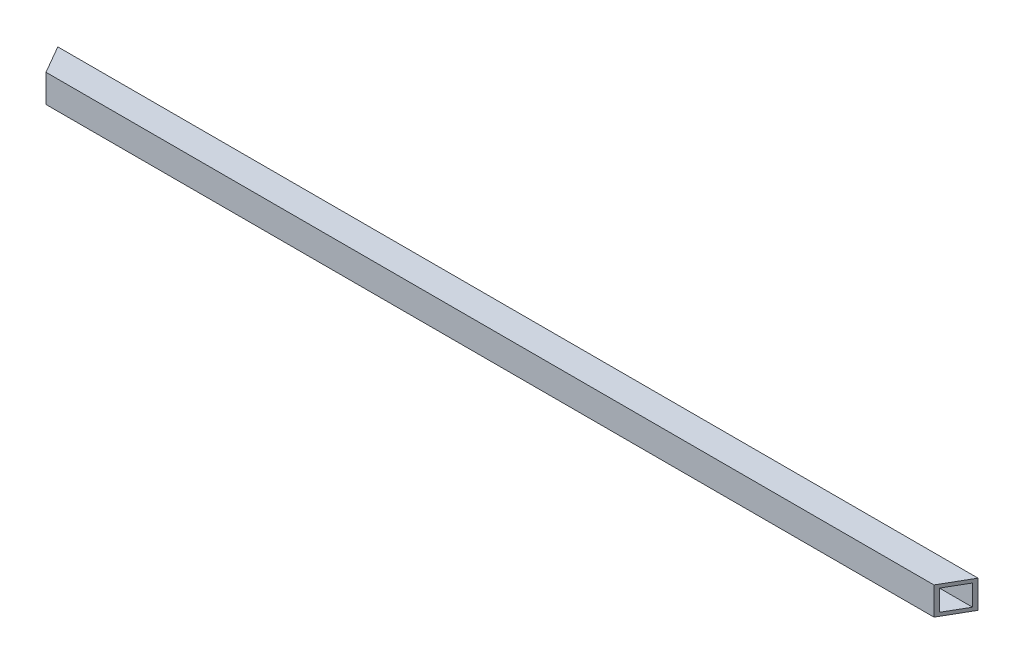
ISO-10303-21;
HEADER;
FILE_DESCRIPTION(('STEP AP214'),'2;1');
FILE_NAME('part.step','',(''),(''),'','','');
FILE_SCHEMA(('AUTOMOTIVE_DESIGN { 1 0 10303 214 1 1 1 1 }'));
ENDSEC;
DATA;
#1=APPLICATION_CONTEXT('core data for automotive mechanical design processes');
#2=APPLICATION_PROTOCOL_DEFINITION('international standard','automotive_design',2000,#1);
#3=PRODUCT_CONTEXT('',#1,'mechanical');
#4=PRODUCT('Part','Part','',(#3));
#5=PRODUCT_RELATED_PRODUCT_CATEGORY('part','',(#4));
#6=PRODUCT_DEFINITION_FORMATION('','',#4);
#7=PRODUCT_DEFINITION_CONTEXT('part definition',#1,'design');
#8=PRODUCT_DEFINITION('design','',#6,#7);
#9=PRODUCT_DEFINITION_SHAPE('','',#8);
#10=(LENGTH_UNIT() NAMED_UNIT(*) SI_UNIT(.MILLI.,.METRE.));
#11=(NAMED_UNIT(*) PLANE_ANGLE_UNIT() SI_UNIT($,.RADIAN.));
#12=(NAMED_UNIT(*) SI_UNIT($,.STERADIAN.) SOLID_ANGLE_UNIT());
#13=UNCERTAINTY_MEASURE_WITH_UNIT(LENGTH_MEASURE(1.E-05),#10,'distance_accuracy_value','');
#14=(GEOMETRIC_REPRESENTATION_CONTEXT(3) GLOBAL_UNCERTAINTY_ASSIGNED_CONTEXT((#13)) GLOBAL_UNIT_ASSIGNED_CONTEXT((#10,
#11,#12)) REPRESENTATION_CONTEXT('',''));
#15=CARTESIAN_POINT('',(0.,0.,0.));
#16=DIRECTION('',(0.,0.,1.));
#17=DIRECTION('',(1.,0.,0.));
#18=AXIS2_PLACEMENT_3D('',#15,#16,#17);
#19=CARTESIAN_POINT('',(-807.917743454652,0.,387.35));
#20=DIRECTION('',(0.,0.,1.));
#21=DIRECTION('',(1.,0.,0.));
#22=AXIS2_PLACEMENT_3D('',#19,#20,#21);
#23=PLANE('',#22);
#24=DIRECTION('',(1.,0.,0.));
#25=VECTOR('',#24,1.);
#26=CARTESIAN_POINT('',(0.,50.8,387.35));
#27=LINE('',#26,#25);
#28=CARTESIAN_POINT('',(-807.917743454659,50.8,387.350000000004));
#29=VERTEX_POINT('',#28);
#30=CARTESIAN_POINT('',(807.917743454652,50.8,387.35));
#31=VERTEX_POINT('',#30);
#32=EDGE_CURVE('E137',#29,#31,#27,.T.);
#33=ORIENTED_EDGE('',*,*,#32,.F.);
#34=DIRECTION('',(0.,1.,0.));
#35=VECTOR('',#34,1.);
#36=CARTESIAN_POINT('',(-807.917743454665,0.,387.350000000008));
#37=LINE('',#36,#35);
#38=CARTESIAN_POINT('',(-807.917743454655,0.,387.350000000002));
#39=VERTEX_POINT('',#38);
#40=EDGE_CURVE('E104',#39,#29,#37,.T.);
#41=ORIENTED_EDGE('',*,*,#40,.F.);
#42=DIRECTION('',(1.,0.,0.));
#43=VECTOR('',#42,1.);
#44=CARTESIAN_POINT('',(0.,0.,387.35));
#45=LINE('',#44,#43);
#46=CARTESIAN_POINT('',(807.917743454652,0.,387.35));
#47=VERTEX_POINT('',#46);
#48=EDGE_CURVE('E88',#39,#47,#45,.T.);
#49=ORIENTED_EDGE('',*,*,#48,.T.);
#50=DIRECTION('',(0.,1.,0.));
#51=VECTOR('',#50,1.);
#52=CARTESIAN_POINT('',(807.917743454652,0.,387.35));
#53=LINE('',#52,#51);
#54=EDGE_CURVE('E127',#31,#47,#53,.F.);
#55=ORIENTED_EDGE('',*,*,#54,.F.);
#56=EDGE_LOOP('',(#33,#41,#49,#55));
#57=FACE_BOUND('',#56,.T.);
#58=ADVANCED_FACE('F16',(#57),#23,.T.);
#59=CARTESIAN_POINT('',(0.,6.35,0.));
#60=DIRECTION('',(0.,1.,0.));
#61=DIRECTION('',(0.,0.,1.));
#62=AXIS2_PLACEMENT_3D('',#59,#60,#61);
#63=PLANE('',#62);
#64=DIRECTION('',(0.500000000000017,0.,-0.866025403784429));
#65=VECTOR('',#64,1.);
#66=CARTESIAN_POINT('',(807.917743454652,6.35,387.35));
#67=LINE('',#66,#65);
#68=CARTESIAN_POINT('',(833.580962920299,6.35,342.899999999978));
#69=VERTEX_POINT('',#68);
#70=CARTESIAN_POINT('',(811.58391766406,6.35,380.999999999993));
#71=VERTEX_POINT('',#70);
#72=EDGE_CURVE('E84',#69,#71,#67,.F.);
#73=ORIENTED_EDGE('',*,*,#72,.F.);
#74=DIRECTION('',(-1.,0.,0.));
#75=VECTOR('',#74,1.);
#76=CARTESIAN_POINT('',(837.247137129504,6.35,342.9));
#77=LINE('',#76,#75);
#78=CARTESIAN_POINT('',(-833.580962920303,6.35,342.89999999998));
#79=VERTEX_POINT('',#78);
#80=EDGE_CURVE('E77',#69,#79,#77,.T.);
#81=ORIENTED_EDGE('',*,*,#80,.T.);
#82=DIRECTION('',(0.500000000000017,0.,0.866025403784429));
#83=VECTOR('',#82,1.);
#84=CARTESIAN_POINT('',(-837.247137129504,6.35,336.55));
#85=LINE('',#84,#83);
#86=CARTESIAN_POINT('',(-811.583917664063,6.35,380.999999999995));
#87=VERTEX_POINT('',#86);
#88=EDGE_CURVE('E81',#87,#79,#85,.F.);
#89=ORIENTED_EDGE('',*,*,#88,.F.);
#90=DIRECTION('',(1.,0.,0.));
#91=VECTOR('',#90,1.);
#92=CARTESIAN_POINT('',(-807.917743454652,6.35,381.));
#93=LINE('',#92,#91);
#94=EDGE_CURVE('E19',#87,#71,#93,.T.);
#95=ORIENTED_EDGE('',*,*,#94,.T.);
#96=EDGE_LOOP('',(#73,#81,#89,#95));
#97=FACE_BOUND('',#96,.T.);
#98=ADVANCED_FACE('F79',(#97),#63,.T.);
#99=CARTESIAN_POINT('',(-807.917743454652,0.,381.));
#100=DIRECTION('',(0.,0.,1.));
#101=DIRECTION('',(1.,0.,0.));
#102=AXIS2_PLACEMENT_3D('',#99,#100,#101);
#103=PLANE('',#102);
#104=DIRECTION('',(1.,0.,0.));
#105=VECTOR('',#104,1.);
#106=CARTESIAN_POINT('',(0.,44.45,381.));
#107=LINE('',#106,#105);
#108=CARTESIAN_POINT('',(-811.583917664063,44.45,380.999999999995));
#109=VERTEX_POINT('',#108);
#110=CARTESIAN_POINT('',(811.58391766406,44.45,380.999999999993));
#111=VERTEX_POINT('',#110);
#112=EDGE_CURVE('E113',#109,#111,#107,.T.);
#113=ORIENTED_EDGE('',*,*,#112,.T.);
#114=DIRECTION('',(0.,1.,0.));
#115=VECTOR('',#114,1.);
#116=CARTESIAN_POINT('',(811.583917664023,0.,380.999999999972));
#117=LINE('',#116,#115);
#118=EDGE_CURVE('E118',#71,#111,#117,.T.);
#119=ORIENTED_EDGE('',*,*,#118,.F.);
#120=ORIENTED_EDGE('',*,*,#94,.F.);
#121=DIRECTION('',(0.,1.,0.));
#122=VECTOR('',#121,1.);
#123=CARTESIAN_POINT('',(-811.583917664036,0.,380.999999999979));
#124=LINE('',#123,#122);
#125=EDGE_CURVE('E103',#109,#87,#124,.F.);
#126=ORIENTED_EDGE('',*,*,#125,.F.);
#127=EDGE_LOOP('',(#113,#119,#120,#126));
#128=FACE_BOUND('',#127,.T.);
#129=ADVANCED_FACE('F119',(#128),#103,.F.);
#130=CARTESIAN_POINT('',(0.,44.45,0.));
#131=DIRECTION('',(0.,1.,0.));
#132=DIRECTION('',(0.,0.,1.));
#133=AXIS2_PLACEMENT_3D('',#130,#131,#132);
#134=PLANE('',#133);
#135=DIRECTION('',(-1.,0.,0.));
#136=VECTOR('',#135,1.);
#137=CARTESIAN_POINT('',(837.247137129504,44.45,342.9));
#138=LINE('',#137,#136);
#139=CARTESIAN_POINT('',(-833.580962920303,44.45,342.89999999998));
#140=VERTEX_POINT('',#139);
#141=CARTESIAN_POINT('',(833.580962920299,44.45,342.899999999978));
#142=VERTEX_POINT('',#141);
#143=EDGE_CURVE('E89',#140,#142,#138,.F.);
#144=ORIENTED_EDGE('',*,*,#143,.T.);
#145=DIRECTION('',(0.500000000000017,0.,-0.866025403784429));
#146=VECTOR('',#145,1.);
#147=CARTESIAN_POINT('',(807.917743454652,44.45,387.35));
#148=LINE('',#147,#146);
#149=EDGE_CURVE('E122',#111,#142,#148,.T.);
#150=ORIENTED_EDGE('',*,*,#149,.F.);
#151=ORIENTED_EDGE('',*,*,#112,.F.);
#152=DIRECTION('',(0.500000000000017,0.,0.866025403784429));
#153=VECTOR('',#152,1.);
#154=CARTESIAN_POINT('',(-837.247137129504,44.45,336.55));
#155=LINE('',#154,#153);
#156=EDGE_CURVE('E97',#140,#109,#155,.T.);
#157=ORIENTED_EDGE('',*,*,#156,.F.);
#158=EDGE_LOOP('',(#144,#150,#151,#157));
#159=FACE_BOUND('',#158,.T.);
#160=ADVANCED_FACE('F143',(#159),#134,.F.);
#161=CARTESIAN_POINT('',(837.247137129504,0.,342.9));
#162=DIRECTION('',(0.,0.,-1.));
#163=DIRECTION('',(-1.,0.,0.));
#164=AXIS2_PLACEMENT_3D('',#161,#162,#163);
#165=PLANE('',#164);
#166=ORIENTED_EDGE('',*,*,#80,.F.);
#167=DIRECTION('',(0.,1.,0.));
#168=VECTOR('',#167,1.);
#169=CARTESIAN_POINT('',(833.580962920183,0.,342.899999999911));
#170=LINE('',#169,#168);
#171=EDGE_CURVE('E126',#142,#69,#170,.F.);
#172=ORIENTED_EDGE('',*,*,#171,.F.);
#173=ORIENTED_EDGE('',*,*,#143,.F.);
#174=DIRECTION('',(0.,1.,0.));
#175=VECTOR('',#174,1.);
#176=CARTESIAN_POINT('',(-833.580962920197,0.,342.899999999918));
#177=LINE('',#176,#175);
#178=EDGE_CURVE('E92',#79,#140,#177,.T.);
#179=ORIENTED_EDGE('',*,*,#178,.F.);
#180=EDGE_LOOP('',(#166,#172,#173,#179));
#181=FACE_BOUND('',#180,.T.);
#182=ADVANCED_FACE('F93',(#181),#165,.F.);
#183=CARTESIAN_POINT('',(0.,0.,0.));
#184=DIRECTION('',(0.,1.,0.));
#185=DIRECTION('',(0.,0.,1.));
#186=AXIS2_PLACEMENT_3D('',#183,#184,#185);
#187=PLANE('',#186);
#188=DIRECTION('',(-1.,0.,0.));
#189=VECTOR('',#188,1.);
#190=CARTESIAN_POINT('',(837.247137129504,0.,336.55));
#191=LINE('',#190,#189);
#192=CARTESIAN_POINT('',(837.247137129501,0.,336.549999999998));
#193=VERTEX_POINT('',#192);
#194=CARTESIAN_POINT('',(-837.247137129504,0.,336.55));
#195=VERTEX_POINT('',#194);
#196=EDGE_CURVE('E144',#193,#195,#191,.T.);
#197=ORIENTED_EDGE('',*,*,#196,.F.);
#198=DIRECTION('',(0.500000000000017,0.,-0.866025403784429));
#199=VECTOR('',#198,1.);
#200=CARTESIAN_POINT('',(807.917743454652,0.,387.35));
#201=LINE('',#200,#199);
#202=EDGE_CURVE('E134',#47,#193,#201,.T.);
#203=ORIENTED_EDGE('',*,*,#202,.F.);
#204=ORIENTED_EDGE('',*,*,#48,.F.);
#205=DIRECTION('',(0.500000000000017,0.,0.866025403784429));
#206=VECTOR('',#205,1.);
#207=CARTESIAN_POINT('',(-837.247137129504,0.,336.55));
#208=LINE('',#207,#206);
#209=EDGE_CURVE('E106',#195,#39,#208,.T.);
#210=ORIENTED_EDGE('',*,*,#209,.F.);
#211=EDGE_LOOP('',(#197,#203,#204,#210));
#212=FACE_BOUND('',#211,.T.);
#213=ADVANCED_FACE('F164',(#212),#187,.F.);
#214=CARTESIAN_POINT('',(-837.247137129504,0.,336.55));
#215=DIRECTION('',(-0.866025403784429,0.,0.500000000000017));
#216=DIRECTION('',(0.500000000000017,0.,0.866025403784429));
#217=AXIS2_PLACEMENT_3D('',#214,#215,#216);
#218=PLANE('',#217);
#219=ORIENTED_EDGE('',*,*,#156,.T.);
#220=ORIENTED_EDGE('',*,*,#125,.T.);
#221=ORIENTED_EDGE('',*,*,#88,.T.);
#222=ORIENTED_EDGE('',*,*,#178,.T.);
#223=EDGE_LOOP('',(#219,#220,#221,#222));
#224=FACE_BOUND('',#223,.T.);
#225=DIRECTION('',(0.500000000000244,0.,0.866025403784298));
#226=VECTOR('',#225,1.);
#227=CARTESIAN_POINT('',(-837.247137129504,50.8,336.55));
#228=LINE('',#227,#226);
#229=CARTESIAN_POINT('',(-837.247137129504,50.8,336.55));
#230=VERTEX_POINT('',#229);
#231=EDGE_CURVE('E139',#230,#29,#228,.T.);
#232=ORIENTED_EDGE('',*,*,#231,.F.);
#233=DIRECTION('',(0.,1.,0.));
#234=VECTOR('',#233,1.);
#235=CARTESIAN_POINT('',(-837.247137129504,0.,336.55));
#236=LINE('',#235,#234);
#237=EDGE_CURVE('E149',#195,#230,#236,.T.);
#238=ORIENTED_EDGE('',*,*,#237,.F.);
#239=ORIENTED_EDGE('',*,*,#209,.T.);
#240=ORIENTED_EDGE('',*,*,#40,.T.);
#241=EDGE_LOOP('',(#232,#238,#239,#240));
#242=FACE_BOUND('',#241,.T.);
#243=ADVANCED_FACE('F100',(#224,#242),#218,.T.);
#244=CARTESIAN_POINT('',(0.,50.8,0.));
#245=DIRECTION('',(0.,1.,0.));
#246=DIRECTION('',(0.,0.,1.));
#247=AXIS2_PLACEMENT_3D('',#244,#245,#246);
#248=PLANE('',#247);
#249=DIRECTION('',(0.500000000000017,0.,-0.866025403784429));
#250=VECTOR('',#249,1.);
#251=CARTESIAN_POINT('',(807.917743454652,50.8,387.35));
#252=LINE('',#251,#250);
#253=CARTESIAN_POINT('',(837.247137129501,50.8,336.549999999998));
#254=VERTEX_POINT('',#253);
#255=EDGE_CURVE('E34',#254,#31,#252,.F.);
#256=ORIENTED_EDGE('',*,*,#255,.F.);
#257=DIRECTION('',(-1.,0.,0.));
#258=VECTOR('',#257,1.);
#259=CARTESIAN_POINT('',(837.247137129504,50.8,336.55));
#260=LINE('',#259,#258);
#261=EDGE_CURVE('E25',#230,#254,#260,.F.);
#262=ORIENTED_EDGE('',*,*,#261,.F.);
#263=ORIENTED_EDGE('',*,*,#231,.T.);
#264=ORIENTED_EDGE('',*,*,#32,.T.);
#265=EDGE_LOOP('',(#256,#262,#263,#264));
#266=FACE_BOUND('',#265,.T.);
#267=ADVANCED_FACE('F156',(#266),#248,.T.);
#268=CARTESIAN_POINT('',(807.917743454652,0.,387.35));
#269=DIRECTION('',(0.866025403784429,0.,0.500000000000017));
#270=DIRECTION('',(0.500000000000017,0.,-0.866025403784429));
#271=AXIS2_PLACEMENT_3D('',#268,#269,#270);
#272=PLANE('',#271);
#273=ORIENTED_EDGE('',*,*,#149,.T.);
#274=ORIENTED_EDGE('',*,*,#171,.T.);
#275=ORIENTED_EDGE('',*,*,#72,.T.);
#276=ORIENTED_EDGE('',*,*,#118,.T.);
#277=EDGE_LOOP('',(#273,#274,#275,#276));
#278=FACE_BOUND('',#277,.T.);
#279=ORIENTED_EDGE('',*,*,#255,.T.);
#280=ORIENTED_EDGE('',*,*,#54,.T.);
#281=ORIENTED_EDGE('',*,*,#202,.T.);
#282=DIRECTION('',(0.,1.,0.));
#283=VECTOR('',#282,1.);
#284=CARTESIAN_POINT('',(837.247137129504,0.,336.55));
#285=LINE('',#284,#283);
#286=EDGE_CURVE('E11',#254,#193,#285,.F.);
#287=ORIENTED_EDGE('',*,*,#286,.F.);
#288=EDGE_LOOP('',(#279,#280,#281,#287));
#289=FACE_BOUND('',#288,.T.);
#290=ADVANCED_FACE('F124',(#278,#289),#272,.T.);
#291=CARTESIAN_POINT('',(837.247137129504,0.,336.55));
#292=DIRECTION('',(0.,0.,-1.));
#293=DIRECTION('',(-1.,0.,0.));
#294=AXIS2_PLACEMENT_3D('',#291,#292,#293);
#295=PLANE('',#294);
#296=ORIENTED_EDGE('',*,*,#261,.T.);
#297=ORIENTED_EDGE('',*,*,#286,.T.);
#298=ORIENTED_EDGE('',*,*,#196,.T.);
#299=ORIENTED_EDGE('',*,*,#237,.T.);
#300=EDGE_LOOP('',(#296,#297,#298,#299));
#301=FACE_BOUND('',#300,.T.);
#302=ADVANCED_FACE('F154',(#301),#295,.T.);
#303=CLOSED_SHELL('',(#58,#98,#129,#160,#182,#213,#243,#267,#290,#302));
#304=MANIFOLD_SOLID_BREP('B1',#303);
#305=ADVANCED_BREP_SHAPE_REPRESENTATION('',(#18,#304),#14);
#306=SHAPE_DEFINITION_REPRESENTATION(#9,#305);
ENDSEC;
END-ISO-10303-21;
